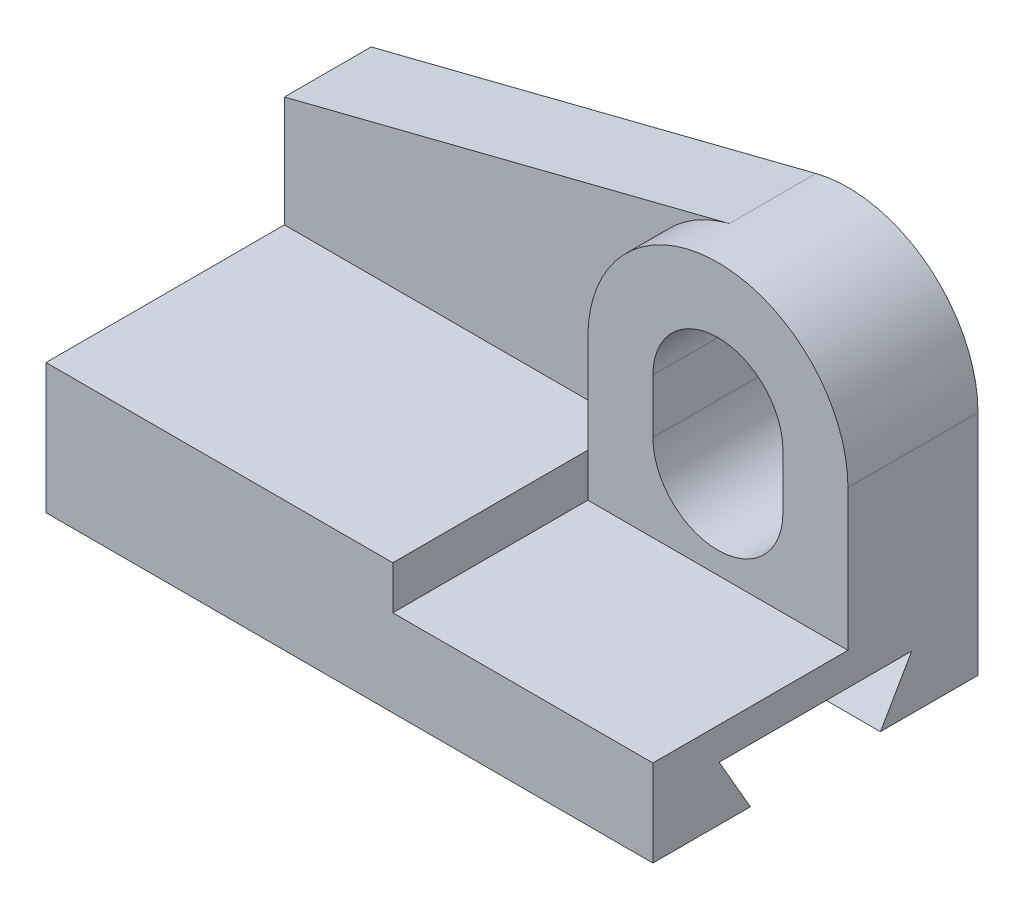
ISO-10303-21;
HEADER;
FILE_DESCRIPTION(('STEP AP214'),'2;1');
FILE_NAME('part.step','',(''),(''),'','','');
FILE_SCHEMA(('AUTOMOTIVE_DESIGN { 1 0 10303 214 1 1 1 1 }'));
ENDSEC;
DATA;
#1=APPLICATION_CONTEXT('core data for automotive mechanical design processes');
#2=APPLICATION_PROTOCOL_DEFINITION('international standard','automotive_design',2000,#1);
#3=PRODUCT_CONTEXT('',#1,'mechanical');
#4=PRODUCT('Part','Part','',(#3));
#5=PRODUCT_RELATED_PRODUCT_CATEGORY('part','',(#4));
#6=PRODUCT_DEFINITION_FORMATION('','',#4);
#7=PRODUCT_DEFINITION_CONTEXT('part definition',#1,'design');
#8=PRODUCT_DEFINITION('design','',#6,#7);
#9=PRODUCT_DEFINITION_SHAPE('','',#8);
#10=(LENGTH_UNIT() NAMED_UNIT(*) SI_UNIT(.MILLI.,.METRE.));
#11=(NAMED_UNIT(*) PLANE_ANGLE_UNIT() SI_UNIT($,.RADIAN.));
#12=(NAMED_UNIT(*) SI_UNIT($,.STERADIAN.) SOLID_ANGLE_UNIT());
#13=UNCERTAINTY_MEASURE_WITH_UNIT(LENGTH_MEASURE(1.E-05),#10,'distance_accuracy_value','');
#14=(GEOMETRIC_REPRESENTATION_CONTEXT(3) GLOBAL_UNCERTAINTY_ASSIGNED_CONTEXT((#13)) GLOBAL_UNIT_ASSIGNED_CONTEXT((#10,
#11,#12)) REPRESENTATION_CONTEXT('',''));
#15=CARTESIAN_POINT('',(0.,0.,0.));
#16=DIRECTION('',(0.,0.,1.));
#17=DIRECTION('',(1.,0.,0.));
#18=AXIS2_PLACEMENT_3D('',#15,#16,#17);
#19=CARTESIAN_POINT('',(0.,0.,0.));
#20=DIRECTION('',(0.,-1.,0.));
#21=DIRECTION('',(0.,0.,-1.));
#22=AXIS2_PLACEMENT_3D('',#19,#20,#21);
#23=PLANE('',#22);
#24=DIRECTION('',(0.,0.,1.));
#25=VECTOR('',#24,1.);
#26=CARTESIAN_POINT('',(-28.,0.,15.));
#27=LINE('',#26,#25);
#28=CARTESIAN_POINT('',(-28.,0.,6.));
#29=VERTEX_POINT('',#28);
#30=CARTESIAN_POINT('',(-28.,0.,15.));
#31=VERTEX_POINT('',#30);
#32=EDGE_CURVE('E206',#29,#31,#27,.T.);
#33=ORIENTED_EDGE('',*,*,#32,.F.);
#34=DIRECTION('',(1.,0.,0.));
#35=VECTOR('',#34,1.);
#36=CARTESIAN_POINT('',(-28.,0.,6.));
#37=LINE('',#36,#35);
#38=CARTESIAN_POINT('',(28.,0.,6.));
#39=VERTEX_POINT('',#38);
#40=EDGE_CURVE('E276',#29,#39,#37,.T.);
#41=ORIENTED_EDGE('',*,*,#40,.T.);
#42=DIRECTION('',(0.,0.,-1.));
#43=VECTOR('',#42,1.);
#44=CARTESIAN_POINT('',(28.,0.,15.));
#45=LINE('',#44,#43);
#46=CARTESIAN_POINT('',(28.,0.,15.));
#47=VERTEX_POINT('',#46);
#48=EDGE_CURVE('E192',#47,#39,#45,.T.);
#49=ORIENTED_EDGE('',*,*,#48,.F.);
#50=DIRECTION('',(1.,0.,0.));
#51=VECTOR('',#50,1.);
#52=CARTESIAN_POINT('',(-28.,0.,15.));
#53=LINE('',#52,#51);
#54=EDGE_CURVE('E207',#31,#47,#53,.T.);
#55=ORIENTED_EDGE('',*,*,#54,.F.);
#56=EDGE_LOOP('',(#33,#41,#49,#55));
#57=FACE_BOUND('',#56,.T.);
#58=ADVANCED_FACE('F43',(#57),#23,.T.);
#59=CARTESIAN_POINT('',(28.,8.,15.));
#60=DIRECTION('',(-1.,0.,0.));
#61=DIRECTION('',(0.,0.,1.));
#62=AXIS2_PLACEMENT_3D('',#59,#60,#61);
#63=PLANE('',#62);
#64=DIRECTION('',(0.,0.86602540378444,-0.499999999999998));
#65=VECTOR('',#64,1.);
#66=CARTESIAN_POINT('',(28.,-2.59807621135331,-4.50000000000001));
#67=LINE('',#66,#65);
#68=CARTESIAN_POINT('',(28.,0.,-6.));
#69=VERTEX_POINT('',#68);
#70=CARTESIAN_POINT('',(28.,5.,-8.88675134594811));
#71=VERTEX_POINT('',#70);
#72=EDGE_CURVE('E172',#69,#71,#67,.T.);
#73=ORIENTED_EDGE('',*,*,#72,.F.);
#74=CARTESIAN_POINT('',(28.,0.,-15.));
#75=VERTEX_POINT('',#74);
#76=EDGE_CURVE('E190',#69,#75,#45,.T.);
#77=ORIENTED_EDGE('',*,*,#76,.T.);
#78=DIRECTION('',(0.,-1.,0.));
#79=VECTOR('',#78,1.);
#80=CARTESIAN_POINT('',(28.,8.,-15.));
#81=LINE('',#80,#79);
#82=CARTESIAN_POINT('',(28.,21.,-15.));
#83=VERTEX_POINT('',#82);
#84=EDGE_CURVE('E11',#83,#75,#81,.T.);
#85=ORIENTED_EDGE('',*,*,#84,.F.);
#86=DIRECTION('',(0.,0.,-1.));
#87=VECTOR('',#86,1.);
#88=CARTESIAN_POINT('',(28.,21.,-3.));
#89=LINE('',#88,#87);
#90=CARTESIAN_POINT('',(28.,21.,-3.));
#91=VERTEX_POINT('',#90);
#92=EDGE_CURVE('E237',#91,#83,#89,.T.);
#93=ORIENTED_EDGE('',*,*,#92,.F.);
#94=DIRECTION('',(0.,1.,0.));
#95=VECTOR('',#94,1.);
#96=CARTESIAN_POINT('',(28.,0.,-3.));
#97=LINE('',#96,#95);
#98=CARTESIAN_POINT('',(28.,8.,-3.));
#99=VERTEX_POINT('',#98);
#100=EDGE_CURVE('E239',#99,#91,#97,.T.);
#101=ORIENTED_EDGE('',*,*,#100,.F.);
#102=DIRECTION('',(0.,0.,-1.));
#103=VECTOR('',#102,1.);
#104=CARTESIAN_POINT('',(28.,8.,15.));
#105=LINE('',#104,#103);
#106=CARTESIAN_POINT('',(28.,8.,15.));
#107=VERTEX_POINT('',#106);
#108=EDGE_CURVE('E211',#107,#99,#105,.T.);
#109=ORIENTED_EDGE('',*,*,#108,.F.);
#110=DIRECTION('',(0.,-1.,0.));
#111=VECTOR('',#110,1.);
#112=CARTESIAN_POINT('',(28.,8.,15.));
#113=LINE('',#112,#111);
#114=EDGE_CURVE('E215',#107,#47,#113,.T.);
#115=ORIENTED_EDGE('',*,*,#114,.T.);
#116=ORIENTED_EDGE('',*,*,#48,.T.);
#117=DIRECTION('',(0.,0.866025403784436,0.500000000000005));
#118=VECTOR('',#117,1.);
#119=CARTESIAN_POINT('',(28.,-2.59807621135333,4.49999999999997));
#120=LINE('',#119,#118);
#121=CARTESIAN_POINT('',(28.,4.99999999999998,8.88675134594815));
#122=VERTEX_POINT('',#121);
#123=EDGE_CURVE('E566',#39,#122,#120,.T.);
#124=ORIENTED_EDGE('',*,*,#123,.T.);
#125=DIRECTION('',(0.,0.,-1.));
#126=VECTOR('',#125,1.);
#127=CARTESIAN_POINT('',(28.,4.99999999999999,0.));
#128=LINE('',#127,#126);
#129=EDGE_CURVE('E187',#122,#71,#128,.T.);
#130=ORIENTED_EDGE('',*,*,#129,.T.);
#131=EDGE_LOOP('',(#73,#77,#85,#93,#101,#109,#115,#116,#124,#130));
#132=FACE_BOUND('',#131,.T.);
#133=ADVANCED_FACE('F44',(#132),#63,.F.);
#134=CARTESIAN_POINT('',(-28.,8.,15.));
#135=DIRECTION('',(1.,0.,0.));
#136=DIRECTION('',(0.,0.,-1.));
#137=AXIS2_PLACEMENT_3D('',#134,#135,#136);
#138=PLANE('',#137);
#139=DIRECTION('',(0.,0.866025403784436,0.500000000000005));
#140=VECTOR('',#139,1.);
#141=CARTESIAN_POINT('',(-28.,-2.59807621135333,4.49999999999997));
#142=LINE('',#141,#140);
#143=CARTESIAN_POINT('',(-28.,4.99999999999998,8.88675134594815));
#144=VERTEX_POINT('',#143);
#145=EDGE_CURVE('E184',#29,#144,#142,.T.);
#146=ORIENTED_EDGE('',*,*,#145,.F.);
#147=ORIENTED_EDGE('',*,*,#32,.T.);
#148=DIRECTION('',(0.,-1.,0.));
#149=VECTOR('',#148,1.);
#150=CARTESIAN_POINT('',(-28.,8.,15.));
#151=LINE('',#150,#149);
#152=CARTESIAN_POINT('',(-28.,12.,15.));
#153=VERTEX_POINT('',#152);
#154=EDGE_CURVE('E214',#153,#31,#151,.T.);
#155=ORIENTED_EDGE('',*,*,#154,.F.);
#156=DIRECTION('',(0.,0.,1.));
#157=VECTOR('',#156,1.);
#158=CARTESIAN_POINT('',(-28.,12.,15.));
#159=LINE('',#158,#157);
#160=CARTESIAN_POINT('',(-28.,12.,-7.));
#161=VERTEX_POINT('',#160);
#162=EDGE_CURVE('E246',#161,#153,#159,.T.);
#163=ORIENTED_EDGE('',*,*,#162,.F.);
#164=DIRECTION('',(0.,1.,0.));
#165=VECTOR('',#164,1.);
#166=CARTESIAN_POINT('',(-28.,0.,-7.));
#167=LINE('',#166,#165);
#168=CARTESIAN_POINT('',(-28.,22.2208669234306,-7.));
#169=VERTEX_POINT('',#168);
#170=EDGE_CURVE('E291',#161,#169,#167,.T.);
#171=ORIENTED_EDGE('',*,*,#170,.T.);
#172=DIRECTION('',(0.,0.,-1.));
#173=VECTOR('',#172,1.);
#174=CARTESIAN_POINT('',(-28.,22.2208669234306,-7.));
#175=LINE('',#174,#173);
#176=CARTESIAN_POINT('',(-28.,22.2208669234306,-15.));
#177=VERTEX_POINT('',#176);
#178=EDGE_CURVE('E224',#169,#177,#175,.T.);
#179=ORIENTED_EDGE('',*,*,#178,.T.);
#180=DIRECTION('',(0.,-1.,0.));
#181=VECTOR('',#180,1.);
#182=CARTESIAN_POINT('',(-28.,8.,-15.));
#183=LINE('',#182,#181);
#184=CARTESIAN_POINT('',(-28.,0.,-15.));
#185=VERTEX_POINT('',#184);
#186=EDGE_CURVE('E51',#177,#185,#183,.T.);
#187=ORIENTED_EDGE('',*,*,#186,.T.);
#188=CARTESIAN_POINT('',(-28.,0.,-6.));
#189=VERTEX_POINT('',#188);
#190=EDGE_CURVE('E210',#185,#189,#27,.T.);
#191=ORIENTED_EDGE('',*,*,#190,.T.);
#192=DIRECTION('',(0.,0.86602540378444,-0.499999999999998));
#193=VECTOR('',#192,1.);
#194=CARTESIAN_POINT('',(-28.,-2.59807621135331,-4.50000000000001));
#195=LINE('',#194,#193);
#196=CARTESIAN_POINT('',(-28.,5.,-8.88675134594811));
#197=VERTEX_POINT('',#196);
#198=EDGE_CURVE('E178',#189,#197,#195,.T.);
#199=ORIENTED_EDGE('',*,*,#198,.T.);
#200=DIRECTION('',(0.,0.,-1.));
#201=VECTOR('',#200,1.);
#202=CARTESIAN_POINT('',(-28.,4.99999999999999,0.));
#203=LINE('',#202,#201);
#204=EDGE_CURVE('E570',#144,#197,#203,.T.);
#205=ORIENTED_EDGE('',*,*,#204,.F.);
#206=EDGE_LOOP('',(#146,#147,#155,#163,#171,#179,#187,#191,#199,#205));
#207=FACE_BOUND('',#206,.T.);
#208=ADVANCED_FACE('F222',(#207),#138,.F.);
#209=CARTESIAN_POINT('',(0.,12.,0.));
#210=DIRECTION('',(0.,-1.,0.));
#211=DIRECTION('',(0.,0.,-1.));
#212=AXIS2_PLACEMENT_3D('',#209,#210,#211);
#213=PLANE('',#212);
#214=DIRECTION('',(1.,0.,0.));
#215=VECTOR('',#214,1.);
#216=CARTESIAN_POINT('',(0.,12.,-7.));
#217=LINE('',#216,#215);
#218=CARTESIAN_POINT('',(4.,12.,-7.));
#219=VERTEX_POINT('',#218);
#220=EDGE_CURVE('E293',#161,#219,#217,.T.);
#221=ORIENTED_EDGE('',*,*,#220,.F.);
#222=ORIENTED_EDGE('',*,*,#162,.T.);
#223=DIRECTION('',(1.,0.,0.));
#224=VECTOR('',#223,1.);
#225=CARTESIAN_POINT('',(-28.,12.,15.));
#226=LINE('',#225,#224);
#227=CARTESIAN_POINT('',(4.,12.,15.));
#228=VERTEX_POINT('',#227);
#229=EDGE_CURVE('E265',#153,#228,#226,.T.);
#230=ORIENTED_EDGE('',*,*,#229,.T.);
#231=DIRECTION('',(0.,0.,-1.));
#232=VECTOR('',#231,1.);
#233=CARTESIAN_POINT('',(4.,12.,-15.));
#234=LINE('',#233,#232);
#235=CARTESIAN_POINT('',(4.,12.,-3.));
#236=VERTEX_POINT('',#235);
#237=EDGE_CURVE('E200',#228,#236,#234,.T.);
#238=ORIENTED_EDGE('',*,*,#237,.T.);
#239=EDGE_CURVE('E262',#236,#219,#234,.T.);
#240=ORIENTED_EDGE('',*,*,#239,.T.);
#241=EDGE_LOOP('',(#221,#222,#230,#238,#240));
#242=FACE_BOUND('',#241,.T.);
#243=ADVANCED_FACE('F342',(#242),#213,.F.);
#244=CARTESIAN_POINT('',(16.,21.,-3.));
#245=DIRECTION('',(0.,0.,-1.));
#246=DIRECTION('',(-1.,0.,0.));
#247=AXIS2_PLACEMENT_3D('',#244,#245,#246);
#248=CYLINDRICAL_SURFACE('',#247,12.);
#249=DIRECTION('',(0.,0.,-1.));
#250=VECTOR('',#249,1.);
#251=CARTESIAN_POINT('',(13.0500186120079,32.6317500751392,-7.));
#252=LINE('',#251,#250);
#253=CARTESIAN_POINT('',(13.0500186120079,32.6317500751392,-7.));
#254=VERTEX_POINT('',#253);
#255=CARTESIAN_POINT('',(13.0500186120079,32.6317500751392,-15.));
#256=VERTEX_POINT('',#255);
#257=EDGE_CURVE('E299',#254,#256,#252,.T.);
#258=ORIENTED_EDGE('',*,*,#257,.F.);
#259=CARTESIAN_POINT('',(16.,21.,-7.));
#260=DIRECTION('',(0.,0.,1.));
#261=DIRECTION('',(1.,0.,0.));
#262=AXIS2_PLACEMENT_3D('',#259,#260,#261);
#263=CIRCLE('',#262,12.);
#264=CARTESIAN_POINT('',(4.,21.,-7.));
#265=VERTEX_POINT('',#264);
#266=EDGE_CURVE('E285',#254,#265,#263,.T.);
#267=ORIENTED_EDGE('',*,*,#266,.T.);
#268=DIRECTION('',(0.,0.,-1.));
#269=VECTOR('',#268,1.);
#270=CARTESIAN_POINT('',(4.,21.,-3.));
#271=LINE('',#270,#269);
#272=CARTESIAN_POINT('',(4.,21.,-3.));
#273=VERTEX_POINT('',#272);
#274=EDGE_CURVE('E241',#273,#265,#271,.T.);
#275=ORIENTED_EDGE('',*,*,#274,.F.);
#276=CARTESIAN_POINT('',(16.,21.,-3.));
#277=DIRECTION('',(0.,0.,1.));
#278=DIRECTION('',(1.,0.,0.));
#279=AXIS2_PLACEMENT_3D('',#276,#277,#278);
#280=CIRCLE('',#279,12.);
#281=EDGE_CURVE('E314',#91,#273,#280,.T.);
#282=ORIENTED_EDGE('',*,*,#281,.F.);
#283=ORIENTED_EDGE('',*,*,#92,.T.);
#284=CARTESIAN_POINT('',(16.,21.,-15.));
#285=DIRECTION('',(0.,0.,1.));
#286=DIRECTION('',(1.,0.,0.));
#287=AXIS2_PLACEMENT_3D('',#284,#285,#286);
#288=CIRCLE('',#287,12.);
#289=EDGE_CURVE('E235',#83,#256,#288,.T.);
#290=ORIENTED_EDGE('',*,*,#289,.T.);
#291=EDGE_LOOP('',(#258,#267,#275,#282,#283,#290));
#292=FACE_BOUND('',#291,.T.);
#293=ADVANCED_FACE('F334',(#292),#248,.T.);
#294=CARTESIAN_POINT('',(0.,8.,0.));
#295=DIRECTION('',(0.,-1.,0.));
#296=DIRECTION('',(0.,0.,-1.));
#297=AXIS2_PLACEMENT_3D('',#294,#295,#296);
#298=PLANE('',#297);
#299=DIRECTION('',(1.,0.,0.));
#300=VECTOR('',#299,1.);
#301=CARTESIAN_POINT('',(0.,8.,-3.));
#302=LINE('',#301,#300);
#303=CARTESIAN_POINT('',(4.,8.,-3.));
#304=VERTEX_POINT('',#303);
#305=EDGE_CURVE('E258',#304,#99,#302,.T.);
#306=ORIENTED_EDGE('',*,*,#305,.F.);
#307=DIRECTION('',(0.,0.,-1.));
#308=VECTOR('',#307,1.);
#309=CARTESIAN_POINT('',(4.,8.,-15.));
#310=LINE('',#309,#308);
#311=CARTESIAN_POINT('',(4.,8.,15.));
#312=VERTEX_POINT('',#311);
#313=EDGE_CURVE('E245',#312,#304,#310,.T.);
#314=ORIENTED_EDGE('',*,*,#313,.F.);
#315=DIRECTION('',(1.,0.,0.));
#316=VECTOR('',#315,1.);
#317=CARTESIAN_POINT('',(-28.,8.,15.));
#318=LINE('',#317,#316);
#319=EDGE_CURVE('E201',#312,#107,#318,.T.);
#320=ORIENTED_EDGE('',*,*,#319,.T.);
#321=ORIENTED_EDGE('',*,*,#108,.T.);
#322=EDGE_LOOP('',(#306,#314,#320,#321));
#323=FACE_BOUND('',#322,.T.);
#324=ADVANCED_FACE('F269',(#323),#298,.F.);
#325=CARTESIAN_POINT('',(-28.,8.,-15.));
#326=DIRECTION('',(0.,0.,1.));
#327=DIRECTION('',(1.,0.,0.));
#328=AXIS2_PLACEMENT_3D('',#325,#326,#327);
#329=PLANE('',#328);
#330=ORIENTED_EDGE('',*,*,#186,.F.);
#331=DIRECTION('',(0.969312506261598,0.245831782332673,0.));
#332=VECTOR('',#331,1.);
#333=CARTESIAN_POINT('',(-6.98709338679876,27.5500463690109,-15.));
#334=LINE('',#333,#332);
#335=EDGE_CURVE('E227',#177,#256,#334,.T.);
#336=ORIENTED_EDGE('',*,*,#335,.T.);
#337=ORIENTED_EDGE('',*,*,#289,.F.);
#338=ORIENTED_EDGE('',*,*,#84,.T.);
#339=DIRECTION('',(-1.,0.,0.));
#340=VECTOR('',#339,1.);
#341=CARTESIAN_POINT('',(-28.,0.,-15.));
#342=LINE('',#341,#340);
#343=EDGE_CURVE('E193',#75,#185,#342,.T.);
#344=ORIENTED_EDGE('',*,*,#343,.T.);
#345=EDGE_LOOP('',(#330,#336,#337,#338,#344));
#346=FACE_BOUND('',#345,.T.);
#347=CARTESIAN_POINT('',(16.,16.,-15.));
#348=DIRECTION('',(0.,0.,1.));
#349=DIRECTION('',(1.,0.,0.));
#350=AXIS2_PLACEMENT_3D('',#347,#348,#349);
#351=CIRCLE('',#350,5.99999999999999);
#352=CARTESIAN_POINT('',(10.,16.,-15.));
#353=VERTEX_POINT('',#352);
#354=CARTESIAN_POINT('',(22.,16.,-15.));
#355=VERTEX_POINT('',#354);
#356=EDGE_CURVE('E301',#353,#355,#351,.T.);
#357=ORIENTED_EDGE('',*,*,#356,.T.);
#358=DIRECTION('',(0.,-1.,0.));
#359=VECTOR('',#358,1.);
#360=CARTESIAN_POINT('',(22.,0.,-15.));
#361=LINE('',#360,#359);
#362=CARTESIAN_POINT('',(22.,21.,-15.));
#363=VERTEX_POINT('',#362);
#364=EDGE_CURVE('E329',#363,#355,#361,.T.);
#365=ORIENTED_EDGE('',*,*,#364,.F.);
#366=CARTESIAN_POINT('',(16.,21.,-15.));
#367=DIRECTION('',(0.,0.,1.));
#368=DIRECTION('',(1.,0.,0.));
#369=AXIS2_PLACEMENT_3D('',#366,#367,#368);
#370=CIRCLE('',#369,5.99999999999999);
#371=CARTESIAN_POINT('',(10.,21.,-15.));
#372=VERTEX_POINT('',#371);
#373=EDGE_CURVE('E330',#363,#372,#370,.T.);
#374=ORIENTED_EDGE('',*,*,#373,.T.);
#375=DIRECTION('',(0.,-1.,0.));
#376=VECTOR('',#375,1.);
#377=CARTESIAN_POINT('',(10.,0.,-15.));
#378=LINE('',#377,#376);
#379=EDGE_CURVE('E322',#372,#353,#378,.T.);
#380=ORIENTED_EDGE('',*,*,#379,.T.);
#381=EDGE_LOOP('',(#357,#365,#374,#380));
#382=FACE_BOUND('',#381,.T.);
#383=ADVANCED_FACE('F230',(#346,#382),#329,.F.);
#384=CARTESIAN_POINT('',(-28.,8.,15.));
#385=DIRECTION('',(0.,0.,-1.));
#386=DIRECTION('',(-1.,0.,0.));
#387=AXIS2_PLACEMENT_3D('',#384,#385,#386);
#388=PLANE('',#387);
#389=ORIENTED_EDGE('',*,*,#54,.T.);
#390=ORIENTED_EDGE('',*,*,#114,.F.);
#391=ORIENTED_EDGE('',*,*,#319,.F.);
#392=DIRECTION('',(0.,-1.,0.));
#393=VECTOR('',#392,1.);
#394=CARTESIAN_POINT('',(4.,12.,15.));
#395=LINE('',#394,#393);
#396=EDGE_CURVE('E194',#228,#312,#395,.T.);
#397=ORIENTED_EDGE('',*,*,#396,.F.);
#398=ORIENTED_EDGE('',*,*,#229,.F.);
#399=ORIENTED_EDGE('',*,*,#154,.T.);
#400=EDGE_LOOP('',(#389,#390,#391,#397,#398,#399));
#401=FACE_BOUND('',#400,.T.);
#402=ADVANCED_FACE('F272',(#401),#388,.F.);
#403=DIRECTION('',(1.,0.,0.));
#404=VECTOR('',#403,1.);
#405=CARTESIAN_POINT('',(-28.,0.,-6.));
#406=LINE('',#405,#404);
#407=EDGE_CURVE('E173',#189,#69,#406,.T.);
#408=ORIENTED_EDGE('',*,*,#407,.F.);
#409=ORIENTED_EDGE('',*,*,#190,.F.);
#410=ORIENTED_EDGE('',*,*,#343,.F.);
#411=ORIENTED_EDGE('',*,*,#76,.F.);
#412=EDGE_LOOP('',(#408,#409,#410,#411));
#413=FACE_BOUND('',#412,.T.);
#414=ADVANCED_FACE('F195',(#413),#23,.T.);
#415=CARTESIAN_POINT('',(4.,12.,-15.));
#416=DIRECTION('',(-1.,0.,0.));
#417=DIRECTION('',(0.,0.,1.));
#418=AXIS2_PLACEMENT_3D('',#415,#416,#417);
#419=PLANE('',#418);
#420=ORIENTED_EDGE('',*,*,#313,.T.);
#421=DIRECTION('',(0.,1.,0.));
#422=VECTOR('',#421,1.);
#423=CARTESIAN_POINT('',(4.,0.,-3.));
#424=LINE('',#423,#422);
#425=EDGE_CURVE('E318',#304,#236,#424,.T.);
#426=ORIENTED_EDGE('',*,*,#425,.T.);
#427=ORIENTED_EDGE('',*,*,#237,.F.);
#428=ORIENTED_EDGE('',*,*,#396,.T.);
#429=EDGE_LOOP('',(#420,#426,#427,#428));
#430=FACE_BOUND('',#429,.T.);
#431=ADVANCED_FACE('F355',(#430),#419,.F.);
#432=CARTESIAN_POINT('',(4.,0.,-3.));
#433=DIRECTION('',(-1.,0.,0.));
#434=DIRECTION('',(0.,0.,1.));
#435=AXIS2_PLACEMENT_3D('',#432,#433,#434);
#436=PLANE('',#435);
#437=DIRECTION('',(0.,1.,0.));
#438=VECTOR('',#437,1.);
#439=CARTESIAN_POINT('',(4.,0.,-7.));
#440=LINE('',#439,#438);
#441=EDGE_CURVE('E66',#219,#265,#440,.T.);
#442=ORIENTED_EDGE('',*,*,#441,.F.);
#443=ORIENTED_EDGE('',*,*,#239,.F.);
#444=EDGE_CURVE('E320',#236,#273,#424,.T.);
#445=ORIENTED_EDGE('',*,*,#444,.T.);
#446=ORIENTED_EDGE('',*,*,#274,.T.);
#447=EDGE_LOOP('',(#442,#443,#445,#446));
#448=FACE_BOUND('',#447,.T.);
#449=ADVANCED_FACE('F346',(#448),#436,.T.);
#450=CARTESIAN_POINT('',(16.,16.,-3.));
#451=DIRECTION('',(0.,0.,-1.));
#452=DIRECTION('',(-1.,0.,0.));
#453=AXIS2_PLACEMENT_3D('',#450,#451,#452);
#454=CYLINDRICAL_SURFACE('',#453,5.99999999999999);
#455=ORIENTED_EDGE('',*,*,#356,.F.);
#456=DIRECTION('',(0.,0.,-1.));
#457=VECTOR('',#456,1.);
#458=CARTESIAN_POINT('',(10.,16.,-3.));
#459=LINE('',#458,#457);
#460=CARTESIAN_POINT('',(10.,16.,-3.));
#461=VERTEX_POINT('',#460);
#462=EDGE_CURVE('E247',#461,#353,#459,.T.);
#463=ORIENTED_EDGE('',*,*,#462,.F.);
#464=CARTESIAN_POINT('',(16.,16.,-3.));
#465=DIRECTION('',(0.,0.,1.));
#466=DIRECTION('',(1.,0.,0.));
#467=AXIS2_PLACEMENT_3D('',#464,#465,#466);
#468=CIRCLE('',#467,5.99999999999999);
#469=CARTESIAN_POINT('',(22.,16.,-3.));
#470=VERTEX_POINT('',#469);
#471=EDGE_CURVE('E305',#461,#470,#468,.T.);
#472=ORIENTED_EDGE('',*,*,#471,.T.);
#473=DIRECTION('',(0.,0.,-1.));
#474=VECTOR('',#473,1.);
#475=CARTESIAN_POINT('',(22.,16.,-3.));
#476=LINE('',#475,#474);
#477=EDGE_CURVE('E251',#470,#355,#476,.T.);
#478=ORIENTED_EDGE('',*,*,#477,.T.);
#479=EDGE_LOOP('',(#455,#463,#472,#478));
#480=FACE_BOUND('',#479,.T.);
#481=ADVANCED_FACE('F363',(#480),#454,.F.);
#482=CARTESIAN_POINT('',(10.,0.,-3.));
#483=DIRECTION('',(1.,0.,0.));
#484=DIRECTION('',(0.,1.,0.));
#485=AXIS2_PLACEMENT_3D('',#482,#483,#484);
#486=PLANE('',#485);
#487=ORIENTED_EDGE('',*,*,#379,.F.);
#488=DIRECTION('',(0.,0.,-1.));
#489=VECTOR('',#488,1.);
#490=CARTESIAN_POINT('',(10.,21.,-3.));
#491=LINE('',#490,#489);
#492=CARTESIAN_POINT('',(10.,21.,-3.));
#493=VERTEX_POINT('',#492);
#494=EDGE_CURVE('E256',#493,#372,#491,.T.);
#495=ORIENTED_EDGE('',*,*,#494,.F.);
#496=DIRECTION('',(0.,-1.,0.));
#497=VECTOR('',#496,1.);
#498=CARTESIAN_POINT('',(10.,0.,-3.));
#499=LINE('',#498,#497);
#500=EDGE_CURVE('E304',#493,#461,#499,.T.);
#501=ORIENTED_EDGE('',*,*,#500,.T.);
#502=ORIENTED_EDGE('',*,*,#462,.T.);
#503=EDGE_LOOP('',(#487,#495,#501,#502));
#504=FACE_BOUND('',#503,.T.);
#505=ADVANCED_FACE('F392',(#504),#486,.T.);
#506=CARTESIAN_POINT('',(16.,21.,-3.));
#507=DIRECTION('',(0.,0.,-1.));
#508=DIRECTION('',(-1.,0.,0.));
#509=AXIS2_PLACEMENT_3D('',#506,#507,#508);
#510=CYLINDRICAL_SURFACE('',#509,5.99999999999999);
#511=ORIENTED_EDGE('',*,*,#373,.F.);
#512=DIRECTION('',(0.,0.,-1.));
#513=VECTOR('',#512,1.);
#514=CARTESIAN_POINT('',(22.,21.,-3.));
#515=LINE('',#514,#513);
#516=CARTESIAN_POINT('',(22.,21.,-3.));
#517=VERTEX_POINT('',#516);
#518=EDGE_CURVE('E254',#517,#363,#515,.T.);
#519=ORIENTED_EDGE('',*,*,#518,.F.);
#520=CARTESIAN_POINT('',(16.,21.,-3.));
#521=DIRECTION('',(0.,0.,1.));
#522=DIRECTION('',(1.,0.,0.));
#523=AXIS2_PLACEMENT_3D('',#520,#521,#522);
#524=CIRCLE('',#523,5.99999999999999);
#525=EDGE_CURVE('E306',#517,#493,#524,.T.);
#526=ORIENTED_EDGE('',*,*,#525,.T.);
#527=ORIENTED_EDGE('',*,*,#494,.T.);
#528=EDGE_LOOP('',(#511,#519,#526,#527));
#529=FACE_BOUND('',#528,.T.);
#530=ADVANCED_FACE('F393',(#529),#510,.F.);
#531=CARTESIAN_POINT('',(22.,0.,-3.));
#532=DIRECTION('',(1.,0.,0.));
#533=DIRECTION('',(0.,0.,-1.));
#534=AXIS2_PLACEMENT_3D('',#531,#532,#533);
#535=PLANE('',#534);
#536=ORIENTED_EDGE('',*,*,#364,.T.);
#537=ORIENTED_EDGE('',*,*,#477,.F.);
#538=DIRECTION('',(0.,-1.,0.));
#539=VECTOR('',#538,1.);
#540=CARTESIAN_POINT('',(22.,0.,-3.));
#541=LINE('',#540,#539);
#542=EDGE_CURVE('E313',#517,#470,#541,.T.);
#543=ORIENTED_EDGE('',*,*,#542,.F.);
#544=ORIENTED_EDGE('',*,*,#518,.T.);
#545=EDGE_LOOP('',(#536,#537,#543,#544));
#546=FACE_BOUND('',#545,.T.);
#547=ADVANCED_FACE('F389',(#546),#535,.F.);
#548=CARTESIAN_POINT('',(0.,0.,-3.));
#549=DIRECTION('',(0.,0.,1.));
#550=DIRECTION('',(1.,0.,0.));
#551=AXIS2_PLACEMENT_3D('',#548,#549,#550);
#552=PLANE('',#551);
#553=ORIENTED_EDGE('',*,*,#471,.F.);
#554=ORIENTED_EDGE('',*,*,#500,.F.);
#555=ORIENTED_EDGE('',*,*,#525,.F.);
#556=ORIENTED_EDGE('',*,*,#542,.T.);
#557=EDGE_LOOP('',(#553,#554,#555,#556));
#558=FACE_BOUND('',#557,.T.);
#559=ORIENTED_EDGE('',*,*,#100,.T.);
#560=ORIENTED_EDGE('',*,*,#281,.T.);
#561=ORIENTED_EDGE('',*,*,#444,.F.);
#562=ORIENTED_EDGE('',*,*,#425,.F.);
#563=ORIENTED_EDGE('',*,*,#305,.T.);
#564=EDGE_LOOP('',(#559,#560,#561,#562,#563));
#565=FACE_BOUND('',#564,.T.);
#566=ADVANCED_FACE('F348',(#558,#565),#552,.T.);
#567=CARTESIAN_POINT('',(-6.98709338679876,27.5500463690109,-7.));
#568=DIRECTION('',(-0.245831782332673,0.969312506261598,0.));
#569=DIRECTION('',(-0.969312506261598,-0.245831782332673,0.));
#570=AXIS2_PLACEMENT_3D('',#567,#568,#569);
#571=PLANE('',#570);
#572=ORIENTED_EDGE('',*,*,#335,.F.);
#573=ORIENTED_EDGE('',*,*,#178,.F.);
#574=DIRECTION('',(0.969312506261598,0.245831782332673,0.));
#575=VECTOR('',#574,1.);
#576=CARTESIAN_POINT('',(-6.98709338679876,27.5500463690109,-7.));
#577=LINE('',#576,#575);
#578=EDGE_CURVE('E289',#169,#254,#577,.T.);
#579=ORIENTED_EDGE('',*,*,#578,.T.);
#580=ORIENTED_EDGE('',*,*,#257,.T.);
#581=EDGE_LOOP('',(#572,#573,#579,#580));
#582=FACE_BOUND('',#581,.T.);
#583=ADVANCED_FACE('F338',(#582),#571,.T.);
#584=CARTESIAN_POINT('',(0.,0.,-7.));
#585=DIRECTION('',(0.,0.,1.));
#586=DIRECTION('',(1.,0.,0.));
#587=AXIS2_PLACEMENT_3D('',#584,#585,#586);
#588=PLANE('',#587);
#589=ORIENTED_EDGE('',*,*,#266,.F.);
#590=ORIENTED_EDGE('',*,*,#578,.F.);
#591=ORIENTED_EDGE('',*,*,#170,.F.);
#592=ORIENTED_EDGE('',*,*,#220,.T.);
#593=ORIENTED_EDGE('',*,*,#441,.T.);
#594=EDGE_LOOP('',(#589,#590,#591,#592,#593));
#595=FACE_BOUND('',#594,.T.);
#596=ADVANCED_FACE('F336',(#595),#588,.T.);
#597=CARTESIAN_POINT('',(-28.,-2.59807621135333,4.49999999999997));
#598=DIRECTION('',(0.,0.500000000000004,-0.866025403784436));
#599=DIRECTION('',(0.,0.866025403784436,0.500000000000004));
#600=AXIS2_PLACEMENT_3D('',#597,#598,#599);
#601=PLANE('',#600);
#602=ORIENTED_EDGE('',*,*,#40,.F.);
#603=ORIENTED_EDGE('',*,*,#145,.T.);
#604=DIRECTION('',(1.,0.,0.));
#605=VECTOR('',#604,1.);
#606=CARTESIAN_POINT('',(-28.,4.99999999999998,8.88675134594815));
#607=LINE('',#606,#605);
#608=EDGE_CURVE('E59',#144,#122,#607,.T.);
#609=ORIENTED_EDGE('',*,*,#608,.T.);
#610=ORIENTED_EDGE('',*,*,#123,.F.);
#611=EDGE_LOOP('',(#602,#603,#609,#610));
#612=FACE_BOUND('',#611,.T.);
#613=ADVANCED_FACE('F419',(#612),#601,.T.);
#614=CARTESIAN_POINT('',(-28.,4.99999999999999,0.));
#615=DIRECTION('',(0.,-1.,0.));
#616=DIRECTION('',(0.,0.,-1.));
#617=AXIS2_PLACEMENT_3D('',#614,#615,#616);
#618=PLANE('',#617);
#619=ORIENTED_EDGE('',*,*,#608,.F.);
#620=ORIENTED_EDGE('',*,*,#204,.T.);
#621=DIRECTION('',(1.,0.,0.));
#622=VECTOR('',#621,1.);
#623=CARTESIAN_POINT('',(-28.,5.,-8.88675134594811));
#624=LINE('',#623,#622);
#625=EDGE_CURVE('E181',#197,#71,#624,.T.);
#626=ORIENTED_EDGE('',*,*,#625,.T.);
#627=ORIENTED_EDGE('',*,*,#129,.F.);
#628=EDGE_LOOP('',(#619,#620,#626,#627));
#629=FACE_BOUND('',#628,.T.);
#630=ADVANCED_FACE('F421',(#629),#618,.T.);
#631=CARTESIAN_POINT('',(-28.,-2.59807621135331,-4.50000000000001));
#632=DIRECTION('',(0.,-0.499999999999998,-0.86602540378444));
#633=DIRECTION('',(0.,0.86602540378444,-0.499999999999998));
#634=AXIS2_PLACEMENT_3D('',#631,#632,#633);
#635=PLANE('',#634);
#636=ORIENTED_EDGE('',*,*,#625,.F.);
#637=ORIENTED_EDGE('',*,*,#198,.F.);
#638=ORIENTED_EDGE('',*,*,#407,.T.);
#639=ORIENTED_EDGE('',*,*,#72,.T.);
#640=EDGE_LOOP('',(#636,#637,#638,#639));
#641=FACE_BOUND('',#640,.T.);
#642=ADVANCED_FACE('F174',(#641),#635,.F.);
#643=CLOSED_SHELL('',(#58,#133,#208,#243,#293,#324,#383,#402,#414,#431,#449,#481,#505,#530,#547,
#566,#583,#596,#613,#630,#642));
#644=MANIFOLD_SOLID_BREP('B2',#643);
#645=ADVANCED_BREP_SHAPE_REPRESENTATION('',(#18,#644),#14);
#646=SHAPE_DEFINITION_REPRESENTATION(#9,#645);
ENDSEC;
END-ISO-10303-21;
